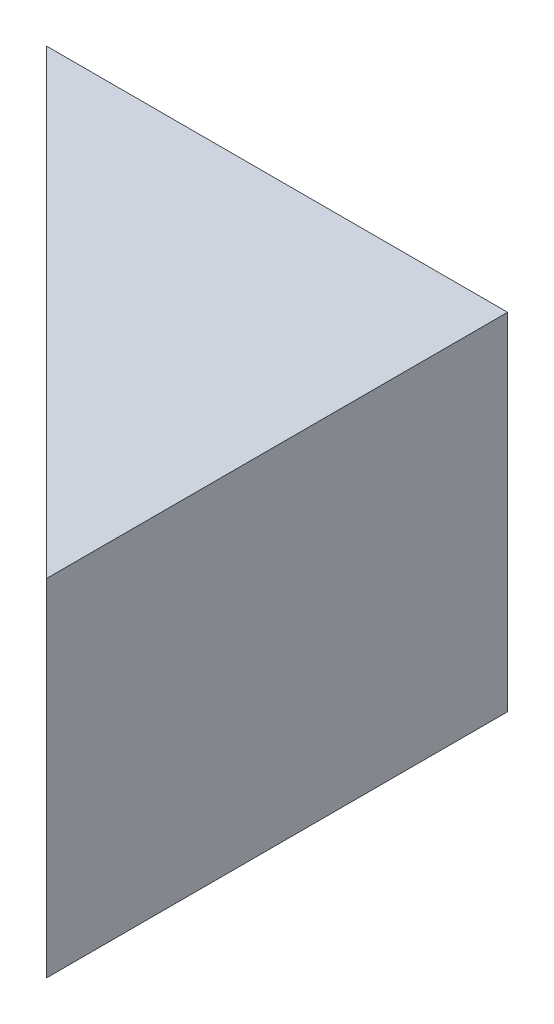
ISO-10303-21;
HEADER;
FILE_DESCRIPTION(('STEP AP214'),'2;1');
FILE_NAME('part.step','',(''),(''),'','','');
FILE_SCHEMA(('AUTOMOTIVE_DESIGN { 1 0 10303 214 1 1 1 1 }'));
ENDSEC;
DATA;
#1=APPLICATION_CONTEXT('core data for automotive mechanical design processes');
#2=APPLICATION_PROTOCOL_DEFINITION('international standard','automotive_design',2000,#1);
#3=PRODUCT_CONTEXT('',#1,'mechanical');
#4=PRODUCT('Part','Part','',(#3));
#5=PRODUCT_RELATED_PRODUCT_CATEGORY('part','',(#4));
#6=PRODUCT_DEFINITION_FORMATION('','',#4);
#7=PRODUCT_DEFINITION_CONTEXT('part definition',#1,'design');
#8=PRODUCT_DEFINITION('design','',#6,#7);
#9=PRODUCT_DEFINITION_SHAPE('','',#8);
#10=(LENGTH_UNIT() NAMED_UNIT(*) SI_UNIT(.MILLI.,.METRE.));
#11=(NAMED_UNIT(*) PLANE_ANGLE_UNIT() SI_UNIT($,.RADIAN.));
#12=(NAMED_UNIT(*) SI_UNIT($,.STERADIAN.) SOLID_ANGLE_UNIT());
#13=UNCERTAINTY_MEASURE_WITH_UNIT(LENGTH_MEASURE(1.E-05),#10,'distance_accuracy_value','');
#14=(GEOMETRIC_REPRESENTATION_CONTEXT(3) GLOBAL_UNCERTAINTY_ASSIGNED_CONTEXT((#13)) GLOBAL_UNIT_ASSIGNED_CONTEXT((#10,
#11,#12)) REPRESENTATION_CONTEXT('',''));
#15=CARTESIAN_POINT('',(0.,0.,0.));
#16=DIRECTION('',(0.,0.,1.));
#17=DIRECTION('',(1.,0.,0.));
#18=AXIS2_PLACEMENT_3D('',#15,#16,#17);
#19=CARTESIAN_POINT('',(0.,7.5,20.));
#20=DIRECTION('',(-1.,0.,0.));
#21=DIRECTION('',(0.,0.,1.));
#22=AXIS2_PLACEMENT_3D('',#19,#20,#21);
#23=PLANE('',#22);
#24=DIRECTION('',(0.,0.,-1.));
#25=VECTOR('',#24,1.);
#26=CARTESIAN_POINT('',(0.,-7.5,20.));
#27=LINE('',#26,#25);
#28=CARTESIAN_POINT('',(0.,-7.5,20.));
#29=VERTEX_POINT('',#28);
#30=CARTESIAN_POINT('',(0.,-7.5,0.));
#31=VERTEX_POINT('',#30);
#32=EDGE_CURVE('E88',#29,#31,#27,.T.);
#33=ORIENTED_EDGE('',*,*,#32,.T.);
#34=DIRECTION('',(0.,-1.,0.));
#35=VECTOR('',#34,1.);
#36=CARTESIAN_POINT('',(0.,7.5,0.));
#37=LINE('',#36,#35);
#38=CARTESIAN_POINT('',(0.,7.5,0.));
#39=VERTEX_POINT('',#38);
#40=EDGE_CURVE('E11',#39,#31,#37,.T.);
#41=ORIENTED_EDGE('',*,*,#40,.F.);
#42=DIRECTION('',(0.,0.,-1.));
#43=VECTOR('',#42,1.);
#44=CARTESIAN_POINT('',(0.,7.5,20.));
#45=LINE('',#44,#43);
#46=CARTESIAN_POINT('',(0.,7.5,20.));
#47=VERTEX_POINT('',#46);
#48=EDGE_CURVE('E81',#47,#39,#45,.T.);
#49=ORIENTED_EDGE('',*,*,#48,.F.);
#50=DIRECTION('',(0.,-1.,0.));
#51=VECTOR('',#50,1.);
#52=CARTESIAN_POINT('',(0.,7.5,20.));
#53=LINE('',#52,#51);
#54=EDGE_CURVE('E89',#47,#29,#53,.T.);
#55=ORIENTED_EDGE('',*,*,#54,.T.);
#56=EDGE_LOOP('',(#33,#41,#49,#55));
#57=FACE_BOUND('',#56,.T.);
#58=ADVANCED_FACE('F41',(#57),#23,.F.);
#59=CARTESIAN_POINT('',(0.,7.5,0.));
#60=DIRECTION('',(0.,0.,1.));
#61=DIRECTION('',(1.,0.,0.));
#62=AXIS2_PLACEMENT_3D('',#59,#60,#61);
#63=PLANE('',#62);
#64=DIRECTION('',(-1.,0.,0.));
#65=VECTOR('',#64,1.);
#66=CARTESIAN_POINT('',(0.,-7.5,0.));
#67=LINE('',#66,#65);
#68=CARTESIAN_POINT('',(-20.,-7.5,0.));
#69=VERTEX_POINT('',#68);
#70=EDGE_CURVE('E69',#31,#69,#67,.T.);
#71=ORIENTED_EDGE('',*,*,#70,.T.);
#72=DIRECTION('',(0.,-1.,0.));
#73=VECTOR('',#72,1.);
#74=CARTESIAN_POINT('',(-20.,7.5,0.));
#75=LINE('',#74,#73);
#76=CARTESIAN_POINT('',(-20.,7.5,0.));
#77=VERTEX_POINT('',#76);
#78=EDGE_CURVE('E49',#77,#69,#75,.T.);
#79=ORIENTED_EDGE('',*,*,#78,.F.);
#80=DIRECTION('',(-1.,0.,0.));
#81=VECTOR('',#80,1.);
#82=CARTESIAN_POINT('',(0.,7.5,0.));
#83=LINE('',#82,#81);
#84=EDGE_CURVE('E77',#39,#77,#83,.T.);
#85=ORIENTED_EDGE('',*,*,#84,.F.);
#86=ORIENTED_EDGE('',*,*,#40,.T.);
#87=EDGE_LOOP('',(#71,#79,#85,#86));
#88=FACE_BOUND('',#87,.T.);
#89=ADVANCED_FACE('F78',(#88),#63,.F.);
#90=CARTESIAN_POINT('',(-20.,7.5,0.));
#91=DIRECTION('',(0.707106781186547,0.,-0.707106781186547));
#92=DIRECTION('',(-0.707106781186548,0.,-0.707106781186548));
#93=AXIS2_PLACEMENT_3D('',#90,#91,#92);
#94=PLANE('',#93);
#95=DIRECTION('',(0.707106781186548,0.,0.707106781186548));
#96=VECTOR('',#95,1.);
#97=CARTESIAN_POINT('',(-20.,-7.5,0.));
#98=LINE('',#97,#96);
#99=EDGE_CURVE('E74',#69,#29,#98,.T.);
#100=ORIENTED_EDGE('',*,*,#99,.T.);
#101=ORIENTED_EDGE('',*,*,#54,.F.);
#102=DIRECTION('',(0.707106781186548,0.,0.707106781186548));
#103=VECTOR('',#102,1.);
#104=CARTESIAN_POINT('',(-20.,7.5,0.));
#105=LINE('',#104,#103);
#106=EDGE_CURVE('E57',#77,#47,#105,.T.);
#107=ORIENTED_EDGE('',*,*,#106,.F.);
#108=ORIENTED_EDGE('',*,*,#78,.T.);
#109=EDGE_LOOP('',(#100,#101,#107,#108));
#110=FACE_BOUND('',#109,.T.);
#111=ADVANCED_FACE('F96',(#110),#94,.F.);
#112=CARTESIAN_POINT('',(0.,7.5,0.));
#113=DIRECTION('',(0.,1.,0.));
#114=DIRECTION('',(0.,0.,1.));
#115=AXIS2_PLACEMENT_3D('',#112,#113,#114);
#116=PLANE('',#115);
#117=ORIENTED_EDGE('',*,*,#48,.T.);
#118=ORIENTED_EDGE('',*,*,#84,.T.);
#119=ORIENTED_EDGE('',*,*,#106,.T.);
#120=EDGE_LOOP('',(#117,#118,#119));
#121=FACE_BOUND('',#120,.T.);
#122=ADVANCED_FACE('F84',(#121),#116,.T.);
#123=CARTESIAN_POINT('',(0.,-7.5,0.));
#124=DIRECTION('',(0.,1.,0.));
#125=DIRECTION('',(0.,0.,1.));
#126=AXIS2_PLACEMENT_3D('',#123,#124,#125);
#127=PLANE('',#126);
#128=ORIENTED_EDGE('',*,*,#32,.F.);
#129=ORIENTED_EDGE('',*,*,#99,.F.);
#130=ORIENTED_EDGE('',*,*,#70,.F.);
#131=EDGE_LOOP('',(#128,#129,#130));
#132=FACE_BOUND('',#131,.T.);
#133=ADVANCED_FACE('F97',(#132),#127,.F.);
#134=CLOSED_SHELL('',(#58,#89,#111,#122,#133));
#135=MANIFOLD_SOLID_BREP('B2',#134);
#136=ADVANCED_BREP_SHAPE_REPRESENTATION('',(#18,#135),#14);
#137=SHAPE_DEFINITION_REPRESENTATION(#9,#136);
ENDSEC;
END-ISO-10303-21;
